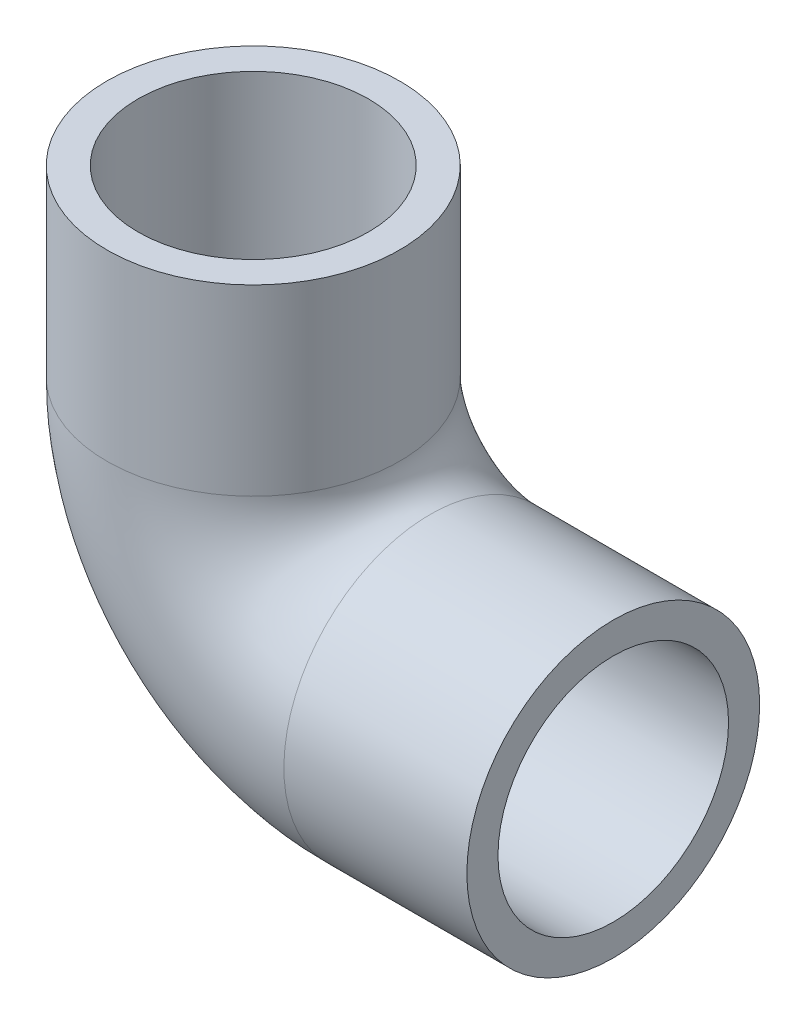
ISO-10303-21;
HEADER;
FILE_DESCRIPTION(('STEP AP214'),'2;1');
FILE_NAME('part.step','',(''),(''),'','','');
FILE_SCHEMA(('AUTOMOTIVE_DESIGN { 1 0 10303 214 1 1 1 1 }'));
ENDSEC;
DATA;
#1=APPLICATION_CONTEXT('core data for automotive mechanical design processes');
#2=APPLICATION_PROTOCOL_DEFINITION('international standard','automotive_design',2000,#1);
#3=PRODUCT_CONTEXT('',#1,'mechanical');
#4=PRODUCT('Part','Part','',(#3));
#5=PRODUCT_RELATED_PRODUCT_CATEGORY('part','',(#4));
#6=PRODUCT_DEFINITION_FORMATION('','',#4);
#7=PRODUCT_DEFINITION_CONTEXT('part definition',#1,'design');
#8=PRODUCT_DEFINITION('design','',#6,#7);
#9=PRODUCT_DEFINITION_SHAPE('','',#8);
#10=(LENGTH_UNIT() NAMED_UNIT(*) SI_UNIT(.MILLI.,.METRE.));
#11=(NAMED_UNIT(*) PLANE_ANGLE_UNIT() SI_UNIT($,.RADIAN.));
#12=(NAMED_UNIT(*) SI_UNIT($,.STERADIAN.) SOLID_ANGLE_UNIT());
#13=UNCERTAINTY_MEASURE_WITH_UNIT(LENGTH_MEASURE(1.E-05),#10,'distance_accuracy_value','');
#14=(GEOMETRIC_REPRESENTATION_CONTEXT(3) GLOBAL_UNCERTAINTY_ASSIGNED_CONTEXT((#13)) GLOBAL_UNIT_ASSIGNED_CONTEXT((#10,
#11,#12)) REPRESENTATION_CONTEXT('',''));
#15=CARTESIAN_POINT('',(0.,0.,0.));
#16=DIRECTION('',(0.,0.,1.));
#17=DIRECTION('',(1.,0.,0.));
#18=AXIS2_PLACEMENT_3D('',#15,#16,#17);
#19=CARTESIAN_POINT('',(0.,12.2861989880592,0.));
#20=DIRECTION('',(0.,0.,1.));
#21=DIRECTION('',(1.,0.,0.));
#22=AXIS2_PLACEMENT_3D('',#19,#20,#21);
#23=TOROIDAL_SURFACE('',#22,12.2861989880592,6.35);
#24=CARTESIAN_POINT('',(-12.2861989880592,12.2861989880592,0.));
#25=DIRECTION('',(0.,-1.,0.));
#26=DIRECTION('',(0.,0.,-1.));
#27=AXIS2_PLACEMENT_3D('',#24,#25,#26);
#28=CIRCLE('',#27,6.35);
#29=CARTESIAN_POINT('',(-18.6361989880592,12.2861989880592,0.));
#30=VERTEX_POINT('',#29);
#31=EDGE_CURVE('E41',#30,#30,#28,.T.);
#32=CARTESIAN_POINT('',(0.,0.,0.));
#33=DIRECTION('',(1.,0.,0.));
#34=DIRECTION('',(0.,0.,-1.));
#35=AXIS2_PLACEMENT_3D('',#32,#33,#34);
#36=CIRCLE('',#35,6.35);
#37=CARTESIAN_POINT('',(0.,-6.35,0.));
#38=VERTEX_POINT('',#37);
#39=EDGE_CURVE('E50',#38,#38,#36,.T.);
#40=CARTESIAN_POINT('',(0.,12.2861989880592,0.));
#41=DIRECTION('',(0.,0.,1.));
#42=DIRECTION('',(1.,0.,0.));
#43=AXIS2_PLACEMENT_3D('',#40,#41,#42);
#44=CIRCLE('',#43,18.6361989880592);
#45=EDGE_CURVE('',#30,#38,#44,.T.);
#46=ORIENTED_EDGE('',*,*,#31,.F.);
#47=ORIENTED_EDGE('',*,*,#39,.T.);
#48=ORIENTED_EDGE('',*,*,#45,.T.);
#49=ORIENTED_EDGE('',*,*,#45,.F.);
#50=EDGE_LOOP('',(#46,#48,#47,#49));
#51=FACE_BOUND('',#50,.T.);
#52=ADVANCED_FACE('F30',(#51),#23,.F.);
#53=CARTESIAN_POINT('',(0.,12.2861989880592,0.));
#54=DIRECTION('',(0.,0.,1.));
#55=DIRECTION('',(1.,0.,0.));
#56=AXIS2_PLACEMENT_3D('',#53,#54,#55);
#57=TOROIDAL_SURFACE('',#56,12.2861989880592,10.16);
#58=CARTESIAN_POINT('',(-12.2861989880592,12.2861989880592,0.));
#59=DIRECTION('',(0.,-1.,0.));
#60=DIRECTION('',(0.,0.,-1.));
#61=AXIS2_PLACEMENT_3D('',#58,#59,#60);
#62=CIRCLE('',#61,10.16);
#63=CARTESIAN_POINT('',(-22.4461989880592,12.2861989880593,0.));
#64=VERTEX_POINT('',#63);
#65=EDGE_CURVE('E37',#64,#64,#62,.T.);
#66=CARTESIAN_POINT('',(0.,0.,0.));
#67=DIRECTION('',(1.,0.,0.));
#68=DIRECTION('',(0.,0.,-1.));
#69=AXIS2_PLACEMENT_3D('',#66,#67,#68);
#70=CIRCLE('',#69,10.16);
#71=CARTESIAN_POINT('',(0.,-10.16,0.));
#72=VERTEX_POINT('',#71);
#73=EDGE_CURVE('E45',#72,#72,#70,.T.);
#74=CARTESIAN_POINT('',(0.,12.2861989880592,0.));
#75=DIRECTION('',(0.,0.,1.));
#76=DIRECTION('',(1.,0.,0.));
#77=AXIS2_PLACEMENT_3D('',#74,#75,#76);
#78=CIRCLE('',#77,22.4461989880592);
#79=EDGE_CURVE('',#64,#72,#78,.T.);
#80=ORIENTED_EDGE('',*,*,#65,.T.);
#81=ORIENTED_EDGE('',*,*,#73,.F.);
#82=ORIENTED_EDGE('',*,*,#79,.T.);
#83=ORIENTED_EDGE('',*,*,#79,.F.);
#84=EDGE_LOOP('',(#80,#82,#81,#83));
#85=FACE_BOUND('',#84,.T.);
#86=ADVANCED_FACE('F32',(#85),#57,.T.);
#87=CARTESIAN_POINT('',(-12.2861989880592,12.2861989880592,0.));
#88=DIRECTION('',(0.,-1.,0.));
#89=DIRECTION('',(0.,0.,-1.));
#90=AXIS2_PLACEMENT_3D('',#87,#88,#89);
#91=PLANE('',#90);
#92=CARTESIAN_POINT('',(-12.2861989880592,12.2861989880592,0.));
#93=DIRECTION('',(0.,1.,0.));
#94=DIRECTION('',(-1.,0.,0.));
#95=AXIS2_PLACEMENT_3D('',#92,#93,#94);
#96=CIRCLE('',#95,8.001);
#97=CARTESIAN_POINT('',(-20.2871989880592,12.2861989880593,0.));
#98=VERTEX_POINT('',#97);
#99=EDGE_CURVE('E57',#98,#98,#96,.T.);
#100=ORIENTED_EDGE('',*,*,#99,.T.);
#101=EDGE_LOOP('',(#100));
#102=FACE_BOUND('',#101,.T.);
#103=ORIENTED_EDGE('',*,*,#31,.T.);
#104=EDGE_LOOP('',(#103));
#105=FACE_BOUND('',#104,.T.);
#106=ADVANCED_FACE('F92',(#102,#105),#91,.F.);
#107=CARTESIAN_POINT('',(0.,0.,0.));
#108=DIRECTION('',(1.,0.,0.));
#109=DIRECTION('',(0.,0.,-1.));
#110=AXIS2_PLACEMENT_3D('',#107,#108,#109);
#111=PLANE('',#110);
#112=CARTESIAN_POINT('',(0.,0.,0.));
#113=DIRECTION('',(1.,0.,0.));
#114=DIRECTION('',(0.,0.,-1.));
#115=AXIS2_PLACEMENT_3D('',#112,#113,#114);
#116=CIRCLE('',#115,8.001);
#117=CARTESIAN_POINT('',(0.,0.,-8.001));
#118=VERTEX_POINT('',#117);
#119=EDGE_CURVE('E10',#118,#118,#116,.F.);
#120=ORIENTED_EDGE('',*,*,#119,.F.);
#121=EDGE_LOOP('',(#120));
#122=FACE_BOUND('',#121,.T.);
#123=ORIENTED_EDGE('',*,*,#39,.F.);
#124=EDGE_LOOP('',(#123));
#125=FACE_BOUND('',#124,.T.);
#126=ADVANCED_FACE('F98',(#122,#125),#111,.T.);
#127=CARTESIAN_POINT('',(-12.2861989880591,24.9861989880592,0.));
#128=DIRECTION('',(0.,1.,0.));
#129=DIRECTION('',(-1.,0.,0.));
#130=AXIS2_PLACEMENT_3D('',#127,#128,#129);
#131=PLANE('',#130);
#132=CARTESIAN_POINT('',(-12.2861989880591,24.9861989880592,0.));
#133=DIRECTION('',(0.,1.,0.));
#134=DIRECTION('',(-1.,0.,0.));
#135=AXIS2_PLACEMENT_3D('',#132,#133,#134);
#136=CIRCLE('',#135,10.16);
#137=CARTESIAN_POINT('',(-22.4461989880591,24.9861989880593,0.));
#138=VERTEX_POINT('',#137);
#139=EDGE_CURVE('E53',#138,#138,#136,.T.);
#140=ORIENTED_EDGE('',*,*,#139,.T.);
#141=EDGE_LOOP('',(#140));
#142=FACE_BOUND('',#141,.T.);
#143=CARTESIAN_POINT('',(-12.2861989880591,24.9861989880592,0.));
#144=DIRECTION('',(0.,1.,0.));
#145=DIRECTION('',(-1.,0.,0.));
#146=AXIS2_PLACEMENT_3D('',#143,#144,#145);
#147=CIRCLE('',#146,8.001);
#148=CARTESIAN_POINT('',(-20.2871989880591,24.9861989880593,0.));
#149=VERTEX_POINT('',#148);
#150=EDGE_CURVE('E56',#149,#149,#147,.T.);
#151=ORIENTED_EDGE('',*,*,#150,.F.);
#152=EDGE_LOOP('',(#151));
#153=FACE_BOUND('',#152,.T.);
#154=ADVANCED_FACE('F102',(#142,#153),#131,.T.);
#155=CARTESIAN_POINT('',(-12.2861989880591,24.9861989880592,0.));
#156=DIRECTION('',(0.,-1.,0.));
#157=DIRECTION('',(1.,0.,0.));
#158=AXIS2_PLACEMENT_3D('',#155,#156,#157);
#159=CYLINDRICAL_SURFACE('',#158,10.16);
#160=ORIENTED_EDGE('',*,*,#139,.F.);
#161=EDGE_LOOP('',(#160));
#162=FACE_BOUND('',#161,.T.);
#163=ORIENTED_EDGE('',*,*,#65,.F.);
#164=EDGE_LOOP('',(#163));
#165=FACE_BOUND('',#164,.T.);
#166=ADVANCED_FACE('F83',(#162,#165),#159,.T.);
#167=CARTESIAN_POINT('',(-12.2861989880591,24.9861989880592,0.));
#168=DIRECTION('',(0.,-1.,0.));
#169=DIRECTION('',(1.,0.,0.));
#170=AXIS2_PLACEMENT_3D('',#167,#168,#169);
#171=CYLINDRICAL_SURFACE('',#170,8.001);
#172=ORIENTED_EDGE('',*,*,#150,.T.);
#173=EDGE_LOOP('',(#172));
#174=FACE_BOUND('',#173,.T.);
#175=ORIENTED_EDGE('',*,*,#99,.F.);
#176=EDGE_LOOP('',(#175));
#177=FACE_BOUND('',#176,.T.);
#178=ADVANCED_FACE('F74',(#174,#177),#171,.F.);
#179=CARTESIAN_POINT('',(12.7,0.,0.));
#180=DIRECTION('',(1.,0.,0.));
#181=DIRECTION('',(0.,0.,-1.));
#182=AXIS2_PLACEMENT_3D('',#179,#180,#181);
#183=PLANE('',#182);
#184=CARTESIAN_POINT('',(12.7,0.,0.));
#185=DIRECTION('',(1.,0.,0.));
#186=DIRECTION('',(0.,0.,-1.));
#187=AXIS2_PLACEMENT_3D('',#184,#185,#186);
#188=CIRCLE('',#187,10.16);
#189=CARTESIAN_POINT('',(12.7,0.,-10.16));
#190=VERTEX_POINT('',#189);
#191=EDGE_CURVE('E60',#190,#190,#188,.T.);
#192=ORIENTED_EDGE('',*,*,#191,.T.);
#193=EDGE_LOOP('',(#192));
#194=FACE_BOUND('',#193,.T.);
#195=CARTESIAN_POINT('',(12.7,0.,0.));
#196=DIRECTION('',(1.,0.,0.));
#197=DIRECTION('',(0.,0.,-1.));
#198=AXIS2_PLACEMENT_3D('',#195,#196,#197);
#199=CIRCLE('',#198,8.001);
#200=CARTESIAN_POINT('',(12.7,0.,-8.001));
#201=VERTEX_POINT('',#200);
#202=EDGE_CURVE('E65',#201,#201,#199,.T.);
#203=ORIENTED_EDGE('',*,*,#202,.F.);
#204=EDGE_LOOP('',(#203));
#205=FACE_BOUND('',#204,.T.);
#206=ADVANCED_FACE('F71',(#194,#205),#183,.T.);
#207=CARTESIAN_POINT('',(12.7,0.,0.));
#208=DIRECTION('',(-1.,0.,0.));
#209=DIRECTION('',(0.,0.,1.));
#210=AXIS2_PLACEMENT_3D('',#207,#208,#209);
#211=CYLINDRICAL_SURFACE('',#210,10.16);
#212=ORIENTED_EDGE('',*,*,#191,.F.);
#213=EDGE_LOOP('',(#212));
#214=FACE_BOUND('',#213,.T.);
#215=ORIENTED_EDGE('',*,*,#73,.T.);
#216=EDGE_LOOP('',(#215));
#217=FACE_BOUND('',#216,.T.);
#218=ADVANCED_FACE('F73',(#214,#217),#211,.T.);
#219=CARTESIAN_POINT('',(12.7,0.,0.));
#220=DIRECTION('',(-1.,0.,0.));
#221=DIRECTION('',(0.,0.,1.));
#222=AXIS2_PLACEMENT_3D('',#219,#220,#221);
#223=CYLINDRICAL_SURFACE('',#222,8.001);
#224=ORIENTED_EDGE('',*,*,#202,.T.);
#225=EDGE_LOOP('',(#224));
#226=FACE_BOUND('',#225,.T.);
#227=ORIENTED_EDGE('',*,*,#119,.T.);
#228=EDGE_LOOP('',(#227));
#229=FACE_BOUND('',#228,.T.);
#230=ADVANCED_FACE('F69',(#226,#229),#223,.F.);
#231=CLOSED_SHELL('',(#52,#86,#106,#126,#154,#166,#178,#206,#218,#230));
#232=MANIFOLD_SOLID_BREP('B2',#231);
#233=ADVANCED_BREP_SHAPE_REPRESENTATION('',(#18,#232),#14);
#234=SHAPE_DEFINITION_REPRESENTATION(#9,#233);
ENDSEC;
END-ISO-10303-21;
